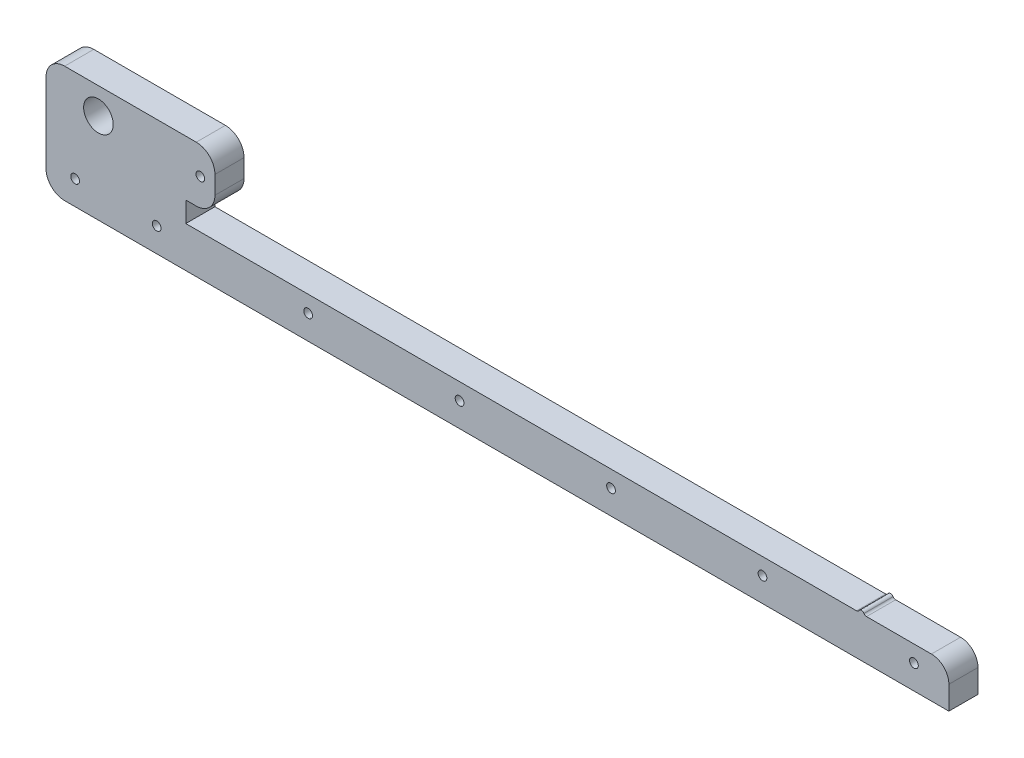
ISO-10303-21;
HEADER;
FILE_DESCRIPTION(('STEP AP214'),'2;1');
FILE_NAME('part.step','',(''),(''),'','','');
FILE_SCHEMA(('AUTOMOTIVE_DESIGN { 1 0 10303 214 1 1 1 1 }'));
ENDSEC;
DATA;
#1=APPLICATION_CONTEXT('core data for automotive mechanical design processes');
#2=APPLICATION_PROTOCOL_DEFINITION('international standard','automotive_design',2000,#1);
#3=PRODUCT_CONTEXT('',#1,'mechanical');
#4=PRODUCT('Part','Part','',(#3));
#5=PRODUCT_RELATED_PRODUCT_CATEGORY('part','',(#4));
#6=PRODUCT_DEFINITION_FORMATION('','',#4);
#7=PRODUCT_DEFINITION_CONTEXT('part definition',#1,'design');
#8=PRODUCT_DEFINITION('design','',#6,#7);
#9=PRODUCT_DEFINITION_SHAPE('','',#8);
#10=(LENGTH_UNIT() NAMED_UNIT(*) SI_UNIT(.MILLI.,.METRE.));
#11=(NAMED_UNIT(*) PLANE_ANGLE_UNIT() SI_UNIT($,.RADIAN.));
#12=(NAMED_UNIT(*) SI_UNIT($,.STERADIAN.) SOLID_ANGLE_UNIT());
#13=UNCERTAINTY_MEASURE_WITH_UNIT(LENGTH_MEASURE(1.E-05),#10,'distance_accuracy_value','');
#14=(GEOMETRIC_REPRESENTATION_CONTEXT(3) GLOBAL_UNCERTAINTY_ASSIGNED_CONTEXT((#13)) GLOBAL_UNIT_ASSIGNED_CONTEXT((#10,
#11,#12)) REPRESENTATION_CONTEXT('',''));
#15=CARTESIAN_POINT('',(0.,0.,0.));
#16=DIRECTION('',(0.,0.,1.));
#17=DIRECTION('',(1.,0.,0.));
#18=AXIS2_PLACEMENT_3D('',#15,#16,#17);
#19=CARTESIAN_POINT('',(394.238844697837,-424.745595982709,10.));
#20=DIRECTION('',(0.,-1.,0.));
#21=DIRECTION('',(0.,0.,-1.));
#22=AXIS2_PLACEMENT_3D('',#19,#20,#21);
#23=PLANE('',#22);
#24=DIRECTION('',(0.,0.,1.));
#25=VECTOR('',#24,1.);
#26=CARTESIAN_POINT('',(627.970895505406,-424.745595982709,0.));
#27=LINE('',#26,#25);
#28=CARTESIAN_POINT('',(627.970895505406,-424.745595982709,0.));
#29=VERTEX_POINT('',#28);
#30=CARTESIAN_POINT('',(627.970895505406,-424.745595982709,10.));
#31=VERTEX_POINT('',#30);
#32=EDGE_CURVE('E58',#29,#31,#27,.T.);
#33=ORIENTED_EDGE('',*,*,#32,.T.);
#34=DIRECTION('',(-1.,0.,0.));
#35=VECTOR('',#34,1.);
#36=CARTESIAN_POINT('',(394.238844697837,-424.745595982709,10.));
#37=LINE('',#36,#35);
#38=CARTESIAN_POINT('',(650.238844697837,-424.745595982709,10.));
#39=VERTEX_POINT('',#38);
#40=EDGE_CURVE('E260',#39,#31,#37,.T.);
#41=ORIENTED_EDGE('',*,*,#40,.F.);
#42=DIRECTION('',(0.,0.,-1.));
#43=VECTOR('',#42,1.);
#44=CARTESIAN_POINT('',(650.238844697837,-424.745595982709,10.));
#45=LINE('',#44,#43);
#46=CARTESIAN_POINT('',(650.238844697837,-424.745595982709,0.));
#47=VERTEX_POINT('',#46);
#48=EDGE_CURVE('E197',#39,#47,#45,.T.);
#49=ORIENTED_EDGE('',*,*,#48,.T.);
#50=DIRECTION('',(-1.,0.,0.));
#51=VECTOR('',#50,1.);
#52=CARTESIAN_POINT('',(394.238844697837,-424.745595982709,0.));
#53=LINE('',#52,#51);
#54=EDGE_CURVE('E286',#47,#29,#53,.T.);
#55=ORIENTED_EDGE('',*,*,#54,.T.);
#56=EDGE_LOOP('',(#33,#41,#49,#55));
#57=FACE_BOUND('',#56,.T.);
#58=ADVANCED_FACE('F35',(#57),#23,.F.);
#59=CARTESIAN_POINT('',(624.506793890268,-424.745595982709,10.));
#60=VERTEX_POINT('',#59);
#61=CARTESIAN_POINT('',(394.238844697837,-424.745595982709,10.));
#62=VERTEX_POINT('',#61);
#63=EDGE_CURVE('E50',#60,#62,#37,.T.);
#64=ORIENTED_EDGE('',*,*,#63,.F.);
#65=DIRECTION('',(0.,0.,1.));
#66=VECTOR('',#65,1.);
#67=CARTESIAN_POINT('',(624.506793890268,-424.745595982709,0.));
#68=LINE('',#67,#66);
#69=CARTESIAN_POINT('',(624.506793890268,-424.745595982709,0.));
#70=VERTEX_POINT('',#69);
#71=EDGE_CURVE('E189',#70,#60,#68,.T.);
#72=ORIENTED_EDGE('',*,*,#71,.F.);
#73=CARTESIAN_POINT('',(394.238844697837,-424.745595982709,0.));
#74=VERTEX_POINT('',#73);
#75=EDGE_CURVE('E285',#70,#74,#53,.T.);
#76=ORIENTED_EDGE('',*,*,#75,.T.);
#77=DIRECTION('',(0.,0.,-1.));
#78=VECTOR('',#77,1.);
#79=CARTESIAN_POINT('',(394.238844697837,-424.745595982709,10.));
#80=LINE('',#79,#78);
#81=EDGE_CURVE('E11',#62,#74,#80,.T.);
#82=ORIENTED_EDGE('',*,*,#81,.F.);
#83=EDGE_LOOP('',(#64,#72,#76,#82));
#84=FACE_BOUND('',#83,.T.);
#85=ADVANCED_FACE('F360',(#84),#23,.F.);
#86=CARTESIAN_POINT('',(656.238844697837,-438.745595982709,10.));
#87=DIRECTION('',(-1.,0.,0.));
#88=DIRECTION('',(0.,0.,1.));
#89=AXIS2_PLACEMENT_3D('',#86,#87,#88);
#90=PLANE('',#89);
#91=DIRECTION('',(0.,1.,0.));
#92=VECTOR('',#91,1.);
#93=CARTESIAN_POINT('',(656.238844697837,-438.745595982709,0.));
#94=LINE('',#93,#92);
#95=CARTESIAN_POINT('',(656.238844697837,-438.745595982709,0.));
#96=VERTEX_POINT('',#95);
#97=CARTESIAN_POINT('',(656.238844697837,-430.745595982709,0.));
#98=VERTEX_POINT('',#97);
#99=EDGE_CURVE('E253',#96,#98,#94,.T.);
#100=ORIENTED_EDGE('',*,*,#99,.T.);
#101=DIRECTION('',(0.,0.,-1.));
#102=VECTOR('',#101,1.);
#103=CARTESIAN_POINT('',(656.238844697837,-430.745595982709,10.));
#104=LINE('',#103,#102);
#105=CARTESIAN_POINT('',(656.238844697837,-430.745595982709,10.));
#106=VERTEX_POINT('',#105);
#107=EDGE_CURVE('E195',#106,#98,#104,.T.);
#108=ORIENTED_EDGE('',*,*,#107,.F.);
#109=DIRECTION('',(0.,1.,0.));
#110=VECTOR('',#109,1.);
#111=CARTESIAN_POINT('',(656.238844697837,-438.745595982709,10.));
#112=LINE('',#111,#110);
#113=CARTESIAN_POINT('',(656.238844697837,-438.745595982709,10.));
#114=VERTEX_POINT('',#113);
#115=EDGE_CURVE('E256',#114,#106,#112,.T.);
#116=ORIENTED_EDGE('',*,*,#115,.F.);
#117=DIRECTION('',(0.,0.,-1.));
#118=VECTOR('',#117,1.);
#119=CARTESIAN_POINT('',(656.238844697837,-438.745595982709,10.));
#120=LINE('',#119,#118);
#121=EDGE_CURVE('E282',#114,#96,#120,.T.);
#122=ORIENTED_EDGE('',*,*,#121,.T.);
#123=EDGE_LOOP('',(#100,#108,#116,#122));
#124=FACE_BOUND('',#123,.T.);
#125=ADVANCED_FACE('F37',(#124),#90,.F.);
#126=CARTESIAN_POINT('',(394.238844697837,-424.745595982709,10.));
#127=DIRECTION('',(-1.,0.,0.));
#128=DIRECTION('',(0.,0.,1.));
#129=AXIS2_PLACEMENT_3D('',#126,#127,#128);
#130=PLANE('',#129);
#131=DIRECTION('',(0.,1.,0.));
#132=VECTOR('',#131,1.);
#133=CARTESIAN_POINT('',(394.238844697837,-424.745595982709,0.));
#134=LINE('',#133,#132);
#135=CARTESIAN_POINT('',(394.238844697837,-417.745595982709,0.));
#136=VERTEX_POINT('',#135);
#137=EDGE_CURVE('E288',#74,#136,#134,.T.);
#138=ORIENTED_EDGE('',*,*,#137,.T.);
#139=DIRECTION('',(0.,0.,-1.));
#140=VECTOR('',#139,1.);
#141=CARTESIAN_POINT('',(394.238844697837,-417.745595982709,10.));
#142=LINE('',#141,#140);
#143=CARTESIAN_POINT('',(394.238844697837,-417.745595982709,10.));
#144=VERTEX_POINT('',#143);
#145=EDGE_CURVE('E43',#144,#136,#142,.T.);
#146=ORIENTED_EDGE('',*,*,#145,.F.);
#147=DIRECTION('',(0.,1.,0.));
#148=VECTOR('',#147,1.);
#149=CARTESIAN_POINT('',(394.238844697837,-424.745595982709,10.));
#150=LINE('',#149,#148);
#151=EDGE_CURVE('E262',#62,#144,#150,.T.);
#152=ORIENTED_EDGE('',*,*,#151,.F.);
#153=ORIENTED_EDGE('',*,*,#81,.T.);
#154=EDGE_LOOP('',(#138,#146,#152,#153));
#155=FACE_BOUND('',#154,.T.);
#156=ADVANCED_FACE('F359',(#155),#130,.F.);
#157=CARTESIAN_POINT('',(397.838844697837,-417.745595982709,10.));
#158=DIRECTION('',(0.,1.,0.));
#159=DIRECTION('',(0.,0.,1.));
#160=AXIS2_PLACEMENT_3D('',#157,#158,#159);
#161=PLANE('',#160);
#162=DIRECTION('',(1.,0.,0.));
#163=VECTOR('',#162,1.);
#164=CARTESIAN_POINT('',(397.838844697837,-417.745595982709,0.));
#165=LINE('',#164,#163);
#166=CARTESIAN_POINT('',(397.838844697837,-417.745595982709,0.));
#167=VERTEX_POINT('',#166);
#168=EDGE_CURVE('E290',#136,#167,#165,.T.);
#169=ORIENTED_EDGE('',*,*,#168,.T.);
#170=DIRECTION('',(0.,0.,-1.));
#171=VECTOR('',#170,1.);
#172=CARTESIAN_POINT('',(397.838844697837,-417.745595982709,10.));
#173=LINE('',#172,#171);
#174=CARTESIAN_POINT('',(397.838844697837,-417.745595982709,10.));
#175=VERTEX_POINT('',#174);
#176=EDGE_CURVE('E331',#175,#167,#173,.T.);
#177=ORIENTED_EDGE('',*,*,#176,.F.);
#178=DIRECTION('',(1.,0.,0.));
#179=VECTOR('',#178,1.);
#180=CARTESIAN_POINT('',(397.838844697837,-417.745595982709,10.));
#181=LINE('',#180,#179);
#182=EDGE_CURVE('E264',#144,#175,#181,.T.);
#183=ORIENTED_EDGE('',*,*,#182,.F.);
#184=ORIENTED_EDGE('',*,*,#145,.T.);
#185=EDGE_LOOP('',(#169,#177,#183,#184));
#186=FACE_BOUND('',#185,.T.);
#187=ADVANCED_FACE('F338',(#186),#161,.F.);
#188=CARTESIAN_POINT('',(397.838844697837,-411.345595982709,10.));
#189=DIRECTION('',(0.,0.,-1.));
#190=DIRECTION('',(-1.,0.,0.));
#191=AXIS2_PLACEMENT_3D('',#188,#189,#190);
#192=CYLINDRICAL_SURFACE('',#191,6.40000000000002);
#193=CARTESIAN_POINT('',(397.838844697837,-411.345595982709,0.));
#194=DIRECTION('',(0.,0.,1.));
#195=DIRECTION('',(1.,0.,0.));
#196=AXIS2_PLACEMENT_3D('',#193,#194,#195);
#197=CIRCLE('',#196,6.40000000000002);
#198=CARTESIAN_POINT('',(404.238844697837,-411.345595982709,0.));
#199=VERTEX_POINT('',#198);
#200=EDGE_CURVE('E292',#167,#199,#197,.T.);
#201=ORIENTED_EDGE('',*,*,#200,.T.);
#202=DIRECTION('',(0.,0.,-1.));
#203=VECTOR('',#202,1.);
#204=CARTESIAN_POINT('',(404.238844697837,-411.345595982709,10.));
#205=LINE('',#204,#203);
#206=CARTESIAN_POINT('',(404.238844697837,-411.345595982709,10.));
#207=VERTEX_POINT('',#206);
#208=EDGE_CURVE('E328',#207,#199,#205,.T.);
#209=ORIENTED_EDGE('',*,*,#208,.F.);
#210=CARTESIAN_POINT('',(397.838844697837,-411.345595982709,10.));
#211=DIRECTION('',(0.,0.,1.));
#212=DIRECTION('',(1.,0.,0.));
#213=AXIS2_PLACEMENT_3D('',#210,#211,#212);
#214=CIRCLE('',#213,6.40000000000002);
#215=EDGE_CURVE('E266',#175,#207,#214,.T.);
#216=ORIENTED_EDGE('',*,*,#215,.F.);
#217=ORIENTED_EDGE('',*,*,#176,.T.);
#218=EDGE_LOOP('',(#201,#209,#216,#217));
#219=FACE_BOUND('',#218,.T.);
#220=ADVANCED_FACE('F348',(#219),#192,.T.);
#221=CARTESIAN_POINT('',(404.238844697837,-411.345595982709,10.));
#222=DIRECTION('',(-1.,0.,0.));
#223=DIRECTION('',(0.,0.,1.));
#224=AXIS2_PLACEMENT_3D('',#221,#222,#223);
#225=PLANE('',#224);
#226=DIRECTION('',(0.,1.,0.));
#227=VECTOR('',#226,1.);
#228=CARTESIAN_POINT('',(404.238844697837,-411.345595982709,0.));
#229=LINE('',#228,#227);
#230=CARTESIAN_POINT('',(404.238844697837,-405.145595982709,0.));
#231=VERTEX_POINT('',#230);
#232=EDGE_CURVE('E294',#199,#231,#229,.T.);
#233=ORIENTED_EDGE('',*,*,#232,.T.);
#234=DIRECTION('',(0.,0.,-1.));
#235=VECTOR('',#234,1.);
#236=CARTESIAN_POINT('',(404.238844697837,-405.145595982709,10.));
#237=LINE('',#236,#235);
#238=CARTESIAN_POINT('',(404.238844697837,-405.145595982709,10.));
#239=VERTEX_POINT('',#238);
#240=EDGE_CURVE('E325',#239,#231,#237,.T.);
#241=ORIENTED_EDGE('',*,*,#240,.F.);
#242=DIRECTION('',(0.,1.,0.));
#243=VECTOR('',#242,1.);
#244=CARTESIAN_POINT('',(404.238844697837,-411.345595982709,10.));
#245=LINE('',#244,#243);
#246=EDGE_CURVE('E268',#207,#239,#245,.T.);
#247=ORIENTED_EDGE('',*,*,#246,.F.);
#248=ORIENTED_EDGE('',*,*,#208,.T.);
#249=EDGE_LOOP('',(#233,#241,#247,#248));
#250=FACE_BOUND('',#249,.T.);
#251=ADVANCED_FACE('F352',(#250),#225,.F.);
#252=CARTESIAN_POINT('',(397.838844697837,-405.145595982709,10.));
#253=DIRECTION('',(0.,0.,-1.));
#254=DIRECTION('',(-1.,0.,0.));
#255=AXIS2_PLACEMENT_3D('',#252,#253,#254);
#256=CYLINDRICAL_SURFACE('',#255,6.40000000000002);
#257=CARTESIAN_POINT('',(397.838844697837,-405.145595982709,0.));
#258=DIRECTION('',(0.,0.,1.));
#259=DIRECTION('',(-1.,0.,0.));
#260=AXIS2_PLACEMENT_3D('',#257,#258,#259);
#261=CIRCLE('',#260,6.40000000000002);
#262=CARTESIAN_POINT('',(397.838844697837,-398.745595982709,0.));
#263=VERTEX_POINT('',#262);
#264=EDGE_CURVE('E296',#231,#263,#261,.T.);
#265=ORIENTED_EDGE('',*,*,#264,.T.);
#266=DIRECTION('',(0.,0.,-1.));
#267=VECTOR('',#266,1.);
#268=CARTESIAN_POINT('',(397.838844697837,-398.745595982709,10.));
#269=LINE('',#268,#267);
#270=CARTESIAN_POINT('',(397.838844697837,-398.745595982709,10.));
#271=VERTEX_POINT('',#270);
#272=EDGE_CURVE('E322',#271,#263,#269,.T.);
#273=ORIENTED_EDGE('',*,*,#272,.F.);
#274=CARTESIAN_POINT('',(397.838844697837,-405.145595982709,10.));
#275=DIRECTION('',(0.,0.,1.));
#276=DIRECTION('',(-1.,0.,0.));
#277=AXIS2_PLACEMENT_3D('',#274,#275,#276);
#278=CIRCLE('',#277,6.40000000000002);
#279=EDGE_CURVE('E270',#239,#271,#278,.T.);
#280=ORIENTED_EDGE('',*,*,#279,.F.);
#281=ORIENTED_EDGE('',*,*,#240,.T.);
#282=EDGE_LOOP('',(#265,#273,#280,#281));
#283=FACE_BOUND('',#282,.T.);
#284=ADVANCED_FACE('F393',(#283),#256,.T.);
#285=CARTESIAN_POINT('',(352.638844697837,-398.745595982709,10.));
#286=DIRECTION('',(0.,-1.,0.));
#287=DIRECTION('',(0.,0.,-1.));
#288=AXIS2_PLACEMENT_3D('',#285,#286,#287);
#289=PLANE('',#288);
#290=DIRECTION('',(-1.,0.,0.));
#291=VECTOR('',#290,1.);
#292=CARTESIAN_POINT('',(352.638844697837,-398.745595982709,0.));
#293=LINE('',#292,#291);
#294=CARTESIAN_POINT('',(352.638844697837,-398.745595982709,0.));
#295=VERTEX_POINT('',#294);
#296=EDGE_CURVE('E299',#263,#295,#293,.T.);
#297=ORIENTED_EDGE('',*,*,#296,.T.);
#298=DIRECTION('',(0.,0.,-1.));
#299=VECTOR('',#298,1.);
#300=CARTESIAN_POINT('',(352.638844697837,-398.745595982709,10.));
#301=LINE('',#300,#299);
#302=CARTESIAN_POINT('',(352.638844697837,-398.745595982709,10.));
#303=VERTEX_POINT('',#302);
#304=EDGE_CURVE('E319',#303,#295,#301,.T.);
#305=ORIENTED_EDGE('',*,*,#304,.F.);
#306=DIRECTION('',(-1.,0.,0.));
#307=VECTOR('',#306,1.);
#308=CARTESIAN_POINT('',(394.238844697837,-398.745595982709,10.));
#309=LINE('',#308,#307);
#310=EDGE_CURVE('E272',#271,#303,#309,.T.);
#311=ORIENTED_EDGE('',*,*,#310,.F.);
#312=ORIENTED_EDGE('',*,*,#272,.T.);
#313=EDGE_LOOP('',(#297,#305,#311,#312));
#314=FACE_BOUND('',#313,.T.);
#315=ADVANCED_FACE('F395',(#314),#289,.F.);
#316=CARTESIAN_POINT('',(352.638844697837,-405.145595982709,10.));
#317=DIRECTION('',(0.,0.,-1.));
#318=DIRECTION('',(-1.,0.,0.));
#319=AXIS2_PLACEMENT_3D('',#316,#317,#318);
#320=CYLINDRICAL_SURFACE('',#319,6.40000000000002);
#321=CARTESIAN_POINT('',(352.638844697837,-405.145595982709,0.));
#322=DIRECTION('',(0.,0.,1.));
#323=DIRECTION('',(-1.,0.,0.));
#324=AXIS2_PLACEMENT_3D('',#321,#322,#323);
#325=CIRCLE('',#324,6.40000000000002);
#326=CARTESIAN_POINT('',(346.238844697837,-405.145595982709,0.));
#327=VERTEX_POINT('',#326);
#328=EDGE_CURVE('E301',#295,#327,#325,.T.);
#329=ORIENTED_EDGE('',*,*,#328,.T.);
#330=DIRECTION('',(0.,0.,-1.));
#331=VECTOR('',#330,1.);
#332=CARTESIAN_POINT('',(346.238844697837,-405.145595982709,10.));
#333=LINE('',#332,#331);
#334=CARTESIAN_POINT('',(346.238844697837,-405.145595982709,10.));
#335=VERTEX_POINT('',#334);
#336=EDGE_CURVE('E316',#335,#327,#333,.T.);
#337=ORIENTED_EDGE('',*,*,#336,.F.);
#338=CARTESIAN_POINT('',(352.638844697837,-405.145595982709,10.));
#339=DIRECTION('',(0.,0.,1.));
#340=DIRECTION('',(-1.,0.,0.));
#341=AXIS2_PLACEMENT_3D('',#338,#339,#340);
#342=CIRCLE('',#341,6.40000000000002);
#343=EDGE_CURVE('E274',#303,#335,#342,.T.);
#344=ORIENTED_EDGE('',*,*,#343,.F.);
#345=ORIENTED_EDGE('',*,*,#304,.T.);
#346=EDGE_LOOP('',(#329,#337,#344,#345));
#347=FACE_BOUND('',#346,.T.);
#348=ADVANCED_FACE('F389',(#347),#320,.T.);
#349=CARTESIAN_POINT('',(346.238844697837,-432.345595982709,10.));
#350=DIRECTION('',(1.,0.,0.));
#351=DIRECTION('',(0.,0.,-1.));
#352=AXIS2_PLACEMENT_3D('',#349,#350,#351);
#353=PLANE('',#352);
#354=DIRECTION('',(0.,-1.,0.));
#355=VECTOR('',#354,1.);
#356=CARTESIAN_POINT('',(346.238844697837,-432.345595982709,0.));
#357=LINE('',#356,#355);
#358=CARTESIAN_POINT('',(346.238844697837,-432.345595982709,0.));
#359=VERTEX_POINT('',#358);
#360=EDGE_CURVE('E303',#327,#359,#357,.T.);
#361=ORIENTED_EDGE('',*,*,#360,.T.);
#362=DIRECTION('',(0.,0.,-1.));
#363=VECTOR('',#362,1.);
#364=CARTESIAN_POINT('',(346.238844697837,-432.345595982709,10.));
#365=LINE('',#364,#363);
#366=CARTESIAN_POINT('',(346.238844697837,-432.345595982709,10.));
#367=VERTEX_POINT('',#366);
#368=EDGE_CURVE('E313',#367,#359,#365,.T.);
#369=ORIENTED_EDGE('',*,*,#368,.F.);
#370=DIRECTION('',(0.,-1.,0.));
#371=VECTOR('',#370,1.);
#372=CARTESIAN_POINT('',(346.238844697837,-432.345595982709,10.));
#373=LINE('',#372,#371);
#374=EDGE_CURVE('E276',#335,#367,#373,.T.);
#375=ORIENTED_EDGE('',*,*,#374,.F.);
#376=ORIENTED_EDGE('',*,*,#336,.T.);
#377=EDGE_LOOP('',(#361,#369,#375,#376));
#378=FACE_BOUND('',#377,.T.);
#379=ADVANCED_FACE('F385',(#378),#353,.F.);
#380=CARTESIAN_POINT('',(352.638844697837,-432.345595982709,10.));
#381=DIRECTION('',(0.,0.,-1.));
#382=DIRECTION('',(-1.,0.,0.));
#383=AXIS2_PLACEMENT_3D('',#380,#381,#382);
#384=CYLINDRICAL_SURFACE('',#383,6.40000000000002);
#385=CARTESIAN_POINT('',(352.638844697837,-432.345595982709,0.));
#386=DIRECTION('',(0.,0.,1.));
#387=DIRECTION('',(-1.,0.,0.));
#388=AXIS2_PLACEMENT_3D('',#385,#386,#387);
#389=CIRCLE('',#388,6.40000000000002);
#390=CARTESIAN_POINT('',(352.638844697837,-438.745595982709,0.));
#391=VERTEX_POINT('',#390);
#392=EDGE_CURVE('E305',#359,#391,#389,.T.);
#393=ORIENTED_EDGE('',*,*,#392,.T.);
#394=DIRECTION('',(0.,0.,-1.));
#395=VECTOR('',#394,1.);
#396=CARTESIAN_POINT('',(352.638844697837,-438.745595982709,10.));
#397=LINE('',#396,#395);
#398=CARTESIAN_POINT('',(352.638844697837,-438.745595982709,10.));
#399=VERTEX_POINT('',#398);
#400=EDGE_CURVE('E310',#399,#391,#397,.T.);
#401=ORIENTED_EDGE('',*,*,#400,.F.);
#402=CARTESIAN_POINT('',(352.638844697837,-432.345595982709,10.));
#403=DIRECTION('',(0.,0.,1.));
#404=DIRECTION('',(-1.,0.,0.));
#405=AXIS2_PLACEMENT_3D('',#402,#403,#404);
#406=CIRCLE('',#405,6.40000000000002);
#407=EDGE_CURVE('E278',#367,#399,#406,.T.);
#408=ORIENTED_EDGE('',*,*,#407,.F.);
#409=ORIENTED_EDGE('',*,*,#368,.T.);
#410=EDGE_LOOP('',(#393,#401,#408,#409));
#411=FACE_BOUND('',#410,.T.);
#412=ADVANCED_FACE('F380',(#411),#384,.T.);
#413=CARTESIAN_POINT('',(656.238844697837,-438.745595982709,10.));
#414=DIRECTION('',(0.,1.,0.));
#415=DIRECTION('',(0.,0.,1.));
#416=AXIS2_PLACEMENT_3D('',#413,#414,#415);
#417=PLANE('',#416);
#418=DIRECTION('',(1.,0.,0.));
#419=VECTOR('',#418,1.);
#420=CARTESIAN_POINT('',(656.238844697837,-438.745595982709,0.));
#421=LINE('',#420,#419);
#422=EDGE_CURVE('E259',#391,#96,#421,.T.);
#423=ORIENTED_EDGE('',*,*,#422,.T.);
#424=ORIENTED_EDGE('',*,*,#121,.F.);
#425=DIRECTION('',(1.,0.,0.));
#426=VECTOR('',#425,1.);
#427=CARTESIAN_POINT('',(656.238844697837,-438.745595982709,10.));
#428=LINE('',#427,#426);
#429=EDGE_CURVE('E280',#399,#114,#428,.T.);
#430=ORIENTED_EDGE('',*,*,#429,.F.);
#431=ORIENTED_EDGE('',*,*,#400,.T.);
#432=EDGE_LOOP('',(#423,#424,#430,#431));
#433=FACE_BOUND('',#432,.T.);
#434=ADVANCED_FACE('F374',(#433),#417,.F.);
#435=CARTESIAN_POINT('',(397.838844697837,-411.345595982709,10.));
#436=DIRECTION('',(0.,0.,1.));
#437=DIRECTION('',(1.,0.,0.));
#438=AXIS2_PLACEMENT_3D('',#435,#436,#437);
#439=PLANE('',#438);
#440=CARTESIAN_POINT('',(650.238844697837,-430.745595982709,10.));
#441=DIRECTION('',(0.,0.,1.));
#442=DIRECTION('',(-1.,0.,0.));
#443=AXIS2_PLACEMENT_3D('',#440,#441,#442);
#444=CIRCLE('',#443,6.00000000000001);
#445=EDGE_CURVE('E192',#106,#39,#444,.T.);
#446=ORIENTED_EDGE('',*,*,#445,.T.);
#447=ORIENTED_EDGE('',*,*,#40,.T.);
#448=CARTESIAN_POINT('',(627.970895505406,-423.745595982709,10.));
#449=DIRECTION('',(0.,0.,-1.));
#450=DIRECTION('',(1.,0.,0.));
#451=AXIS2_PLACEMENT_3D('',#448,#449,#450);
#452=CIRCLE('',#451,1.);
#453=CARTESIAN_POINT('',(627.104870101621,-424.245595982709,10.));
#454=VERTEX_POINT('',#453);
#455=EDGE_CURVE('E184',#31,#454,#452,.T.);
#456=ORIENTED_EDGE('',*,*,#455,.T.);
#457=CARTESIAN_POINT('',(626.238844697837,-424.745595982709,10.));
#458=DIRECTION('',(0.,0.,1.));
#459=DIRECTION('',(1.,0.,0.));
#460=AXIS2_PLACEMENT_3D('',#457,#458,#459);
#461=CIRCLE('',#460,1.);
#462=CARTESIAN_POINT('',(625.372819294052,-424.245595982709,10.));
#463=VERTEX_POINT('',#462);
#464=EDGE_CURVE('E161',#454,#463,#461,.T.);
#465=ORIENTED_EDGE('',*,*,#464,.T.);
#466=CARTESIAN_POINT('',(624.506793890268,-423.745595982709,10.));
#467=DIRECTION('',(0.,0.,-1.));
#468=DIRECTION('',(-1.,0.,0.));
#469=AXIS2_PLACEMENT_3D('',#466,#467,#468);
#470=CIRCLE('',#469,1.);
#471=EDGE_CURVE('E178',#463,#60,#470,.T.);
#472=ORIENTED_EDGE('',*,*,#471,.T.);
#473=ORIENTED_EDGE('',*,*,#63,.T.);
#474=ORIENTED_EDGE('',*,*,#151,.T.);
#475=ORIENTED_EDGE('',*,*,#182,.T.);
#476=ORIENTED_EDGE('',*,*,#215,.T.);
#477=ORIENTED_EDGE('',*,*,#246,.T.);
#478=ORIENTED_EDGE('',*,*,#279,.T.);
#479=ORIENTED_EDGE('',*,*,#310,.T.);
#480=ORIENTED_EDGE('',*,*,#343,.T.);
#481=ORIENTED_EDGE('',*,*,#374,.T.);
#482=ORIENTED_EDGE('',*,*,#407,.T.);
#483=ORIENTED_EDGE('',*,*,#429,.T.);
#484=ORIENTED_EDGE('',*,*,#115,.T.);
#485=EDGE_LOOP('',(#446,#447,#456,#465,#472,#473,#474,#475,#476,#477,#478,#479,#480,#481,#482,
#483,#484));
#486=FACE_BOUND('',#485,.T.);
#487=CARTESIAN_POINT('',(364.238844697837,-407.745595982709,10.));
#488=DIRECTION('',(0.,0.,-1.));
#489=DIRECTION('',(-1.,0.,0.));
#490=AXIS2_PLACEMENT_3D('',#487,#488,#489);
#491=CIRCLE('',#490,5.07499999999998);
#492=CARTESIAN_POINT('',(359.163844697837,-407.745595982709,10.));
#493=VERTEX_POINT('',#492);
#494=EDGE_CURVE('E202',#493,#493,#491,.T.);
#495=ORIENTED_EDGE('',*,*,#494,.T.);
#496=EDGE_LOOP('',(#495));
#497=FACE_BOUND('',#496,.T.);
#498=CARTESIAN_POINT('',(399.238844697837,-408.245595982709,10.));
#499=DIRECTION('',(0.,0.,1.));
#500=DIRECTION('',(1.,0.,0.));
#501=AXIS2_PLACEMENT_3D('',#498,#499,#500);
#502=CIRCLE('',#501,1.50000000000002);
#503=CARTESIAN_POINT('',(400.738844697837,-408.245595982709,10.));
#504=VERTEX_POINT('',#503);
#505=EDGE_CURVE('E205',#504,#504,#502,.T.);
#506=ORIENTED_EDGE('',*,*,#505,.F.);
#507=EDGE_LOOP('',(#506));
#508=FACE_BOUND('',#507,.T.);
#509=CARTESIAN_POINT('',(356.238844697836,-430.436890599708,10.));
#510=DIRECTION('',(0.,0.,1.));
#511=DIRECTION('',(1.,0.,0.));
#512=AXIS2_PLACEMENT_3D('',#509,#510,#511);
#513=CIRCLE('',#512,1.50000000000002);
#514=CARTESIAN_POINT('',(357.738844697836,-430.436890599708,10.));
#515=VERTEX_POINT('',#514);
#516=EDGE_CURVE('E211',#515,#515,#513,.T.);
#517=ORIENTED_EDGE('',*,*,#516,.F.);
#518=EDGE_LOOP('',(#517));
#519=FACE_BOUND('',#518,.T.);
#520=CARTESIAN_POINT('',(384.238844697836,-430.436890599708,10.));
#521=DIRECTION('',(0.,0.,1.));
#522=DIRECTION('',(1.,0.,0.));
#523=AXIS2_PLACEMENT_3D('',#520,#521,#522);
#524=CIRCLE('',#523,1.50000000000002);
#525=CARTESIAN_POINT('',(385.738844697836,-430.436890599708,10.));
#526=VERTEX_POINT('',#525);
#527=EDGE_CURVE('E217',#526,#526,#524,.T.);
#528=ORIENTED_EDGE('',*,*,#527,.F.);
#529=EDGE_LOOP('',(#528));
#530=FACE_BOUND('',#529,.T.);
#531=CARTESIAN_POINT('',(436.238844697836,-430.436890599708,10.));
#532=DIRECTION('',(0.,0.,1.));
#533=DIRECTION('',(1.,0.,0.));
#534=AXIS2_PLACEMENT_3D('',#531,#532,#533);
#535=CIRCLE('',#534,1.50000000000002);
#536=CARTESIAN_POINT('',(437.738844697836,-430.436890599708,10.));
#537=VERTEX_POINT('',#536);
#538=EDGE_CURVE('E223',#537,#537,#535,.T.);
#539=ORIENTED_EDGE('',*,*,#538,.F.);
#540=EDGE_LOOP('',(#539));
#541=FACE_BOUND('',#540,.T.);
#542=CARTESIAN_POINT('',(488.238844697836,-430.436890599709,10.));
#543=DIRECTION('',(0.,0.,1.));
#544=DIRECTION('',(1.,0.,0.));
#545=AXIS2_PLACEMENT_3D('',#542,#543,#544);
#546=CIRCLE('',#545,1.50000000000002);
#547=CARTESIAN_POINT('',(489.738844697836,-430.436890599709,10.));
#548=VERTEX_POINT('',#547);
#549=EDGE_CURVE('E229',#548,#548,#546,.T.);
#550=ORIENTED_EDGE('',*,*,#549,.F.);
#551=EDGE_LOOP('',(#550));
#552=FACE_BOUND('',#551,.T.);
#553=CARTESIAN_POINT('',(540.238844697836,-430.436890599709,10.));
#554=DIRECTION('',(0.,0.,1.));
#555=DIRECTION('',(1.,0.,0.));
#556=AXIS2_PLACEMENT_3D('',#553,#554,#555);
#557=CIRCLE('',#556,1.50000000000008);
#558=CARTESIAN_POINT('',(541.738844697836,-430.436890599709,10.));
#559=VERTEX_POINT('',#558);
#560=EDGE_CURVE('E235',#559,#559,#557,.T.);
#561=ORIENTED_EDGE('',*,*,#560,.F.);
#562=EDGE_LOOP('',(#561));
#563=FACE_BOUND('',#562,.T.);
#564=CARTESIAN_POINT('',(592.238844697836,-430.436890599709,10.));
#565=DIRECTION('',(0.,0.,1.));
#566=DIRECTION('',(1.,0.,0.));
#567=AXIS2_PLACEMENT_3D('',#564,#565,#566);
#568=CIRCLE('',#567,1.49999999999997);
#569=CARTESIAN_POINT('',(593.738844697836,-430.436890599709,10.));
#570=VERTEX_POINT('',#569);
#571=EDGE_CURVE('E241',#570,#570,#568,.T.);
#572=ORIENTED_EDGE('',*,*,#571,.F.);
#573=EDGE_LOOP('',(#572));
#574=FACE_BOUND('',#573,.T.);
#575=CARTESIAN_POINT('',(644.238844697836,-430.43689059971,10.));
#576=DIRECTION('',(0.,0.,1.));
#577=DIRECTION('',(1.,0.,0.));
#578=AXIS2_PLACEMENT_3D('',#575,#576,#577);
#579=CIRCLE('',#578,1.49999999999997);
#580=CARTESIAN_POINT('',(645.738844697836,-430.43689059971,10.));
#581=VERTEX_POINT('',#580);
#582=EDGE_CURVE('E247',#581,#581,#579,.T.);
#583=ORIENTED_EDGE('',*,*,#582,.F.);
#584=EDGE_LOOP('',(#583));
#585=FACE_BOUND('',#584,.T.);
#586=ADVANCED_FACE('F356',(#486,#497,#508,#519,#530,#541,#552,#563,#574,#585),#439,.T.);
#587=CARTESIAN_POINT('',(397.838844697837,-411.345595982709,0.));
#588=DIRECTION('',(0.,0.,1.));
#589=DIRECTION('',(1.,0.,0.));
#590=AXIS2_PLACEMENT_3D('',#587,#588,#589);
#591=PLANE('',#590);
#592=CARTESIAN_POINT('',(364.238844697837,-407.745595982709,0.));
#593=DIRECTION('',(0.,0.,-1.));
#594=DIRECTION('',(-1.,0.,0.));
#595=AXIS2_PLACEMENT_3D('',#592,#593,#594);
#596=CIRCLE('',#595,5.07499999999998);
#597=CARTESIAN_POINT('',(359.163844697837,-407.745595982709,0.));
#598=VERTEX_POINT('',#597);
#599=EDGE_CURVE('E200',#598,#598,#596,.T.);
#600=ORIENTED_EDGE('',*,*,#599,.F.);
#601=EDGE_LOOP('',(#600));
#602=FACE_BOUND('',#601,.T.);
#603=CARTESIAN_POINT('',(399.238844697837,-408.245595982709,0.));
#604=DIRECTION('',(0.,0.,1.));
#605=DIRECTION('',(1.,0.,0.));
#606=AXIS2_PLACEMENT_3D('',#603,#604,#605);
#607=CIRCLE('',#606,1.50000000000002);
#608=CARTESIAN_POINT('',(400.738844697837,-408.245595982709,0.));
#609=VERTEX_POINT('',#608);
#610=EDGE_CURVE('E208',#609,#609,#607,.T.);
#611=ORIENTED_EDGE('',*,*,#610,.T.);
#612=EDGE_LOOP('',(#611));
#613=FACE_BOUND('',#612,.T.);
#614=CARTESIAN_POINT('',(356.238844697836,-430.436890599708,0.));
#615=DIRECTION('',(0.,0.,1.));
#616=DIRECTION('',(1.,0.,0.));
#617=AXIS2_PLACEMENT_3D('',#614,#615,#616);
#618=CIRCLE('',#617,1.50000000000002);
#619=CARTESIAN_POINT('',(357.738844697836,-430.436890599708,0.));
#620=VERTEX_POINT('',#619);
#621=EDGE_CURVE('E214',#620,#620,#618,.T.);
#622=ORIENTED_EDGE('',*,*,#621,.T.);
#623=EDGE_LOOP('',(#622));
#624=FACE_BOUND('',#623,.T.);
#625=CARTESIAN_POINT('',(384.238844697836,-430.436890599708,0.));
#626=DIRECTION('',(0.,0.,1.));
#627=DIRECTION('',(1.,0.,0.));
#628=AXIS2_PLACEMENT_3D('',#625,#626,#627);
#629=CIRCLE('',#628,1.50000000000002);
#630=CARTESIAN_POINT('',(385.738844697836,-430.436890599708,0.));
#631=VERTEX_POINT('',#630);
#632=EDGE_CURVE('E220',#631,#631,#629,.T.);
#633=ORIENTED_EDGE('',*,*,#632,.T.);
#634=EDGE_LOOP('',(#633));
#635=FACE_BOUND('',#634,.T.);
#636=CARTESIAN_POINT('',(436.238844697836,-430.436890599708,0.));
#637=DIRECTION('',(0.,0.,1.));
#638=DIRECTION('',(1.,0.,0.));
#639=AXIS2_PLACEMENT_3D('',#636,#637,#638);
#640=CIRCLE('',#639,1.50000000000002);
#641=CARTESIAN_POINT('',(437.738844697836,-430.436890599708,0.));
#642=VERTEX_POINT('',#641);
#643=EDGE_CURVE('E226',#642,#642,#640,.T.);
#644=ORIENTED_EDGE('',*,*,#643,.T.);
#645=EDGE_LOOP('',(#644));
#646=FACE_BOUND('',#645,.T.);
#647=CARTESIAN_POINT('',(488.238844697836,-430.436890599709,0.));
#648=DIRECTION('',(0.,0.,1.));
#649=DIRECTION('',(1.,0.,0.));
#650=AXIS2_PLACEMENT_3D('',#647,#648,#649);
#651=CIRCLE('',#650,1.50000000000002);
#652=CARTESIAN_POINT('',(489.738844697836,-430.436890599709,0.));
#653=VERTEX_POINT('',#652);
#654=EDGE_CURVE('E232',#653,#653,#651,.T.);
#655=ORIENTED_EDGE('',*,*,#654,.T.);
#656=EDGE_LOOP('',(#655));
#657=FACE_BOUND('',#656,.T.);
#658=CARTESIAN_POINT('',(540.238844697836,-430.436890599709,0.));
#659=DIRECTION('',(0.,0.,1.));
#660=DIRECTION('',(1.,0.,0.));
#661=AXIS2_PLACEMENT_3D('',#658,#659,#660);
#662=CIRCLE('',#661,1.50000000000008);
#663=CARTESIAN_POINT('',(541.738844697836,-430.436890599709,0.));
#664=VERTEX_POINT('',#663);
#665=EDGE_CURVE('E238',#664,#664,#662,.T.);
#666=ORIENTED_EDGE('',*,*,#665,.T.);
#667=EDGE_LOOP('',(#666));
#668=FACE_BOUND('',#667,.T.);
#669=CARTESIAN_POINT('',(592.238844697836,-430.436890599709,0.));
#670=DIRECTION('',(0.,0.,1.));
#671=DIRECTION('',(1.,0.,0.));
#672=AXIS2_PLACEMENT_3D('',#669,#670,#671);
#673=CIRCLE('',#672,1.49999999999997);
#674=CARTESIAN_POINT('',(593.738844697836,-430.436890599709,0.));
#675=VERTEX_POINT('',#674);
#676=EDGE_CURVE('E244',#675,#675,#673,.T.);
#677=ORIENTED_EDGE('',*,*,#676,.T.);
#678=EDGE_LOOP('',(#677));
#679=FACE_BOUND('',#678,.T.);
#680=CARTESIAN_POINT('',(644.238844697836,-430.43689059971,0.));
#681=DIRECTION('',(0.,0.,1.));
#682=DIRECTION('',(1.,0.,0.));
#683=AXIS2_PLACEMENT_3D('',#680,#681,#682);
#684=CIRCLE('',#683,1.49999999999997);
#685=CARTESIAN_POINT('',(645.738844697836,-430.43689059971,0.));
#686=VERTEX_POINT('',#685);
#687=EDGE_CURVE('E250',#686,#686,#684,.T.);
#688=ORIENTED_EDGE('',*,*,#687,.T.);
#689=EDGE_LOOP('',(#688));
#690=FACE_BOUND('',#689,.T.);
#691=ORIENTED_EDGE('',*,*,#54,.F.);
#692=CARTESIAN_POINT('',(650.238844697837,-430.745595982709,0.));
#693=DIRECTION('',(0.,0.,1.));
#694=DIRECTION('',(-1.,0.,0.));
#695=AXIS2_PLACEMENT_3D('',#692,#693,#694);
#696=CIRCLE('',#695,6.00000000000001);
#697=EDGE_CURVE('E188',#98,#47,#696,.T.);
#698=ORIENTED_EDGE('',*,*,#697,.F.);
#699=ORIENTED_EDGE('',*,*,#99,.F.);
#700=ORIENTED_EDGE('',*,*,#422,.F.);
#701=ORIENTED_EDGE('',*,*,#392,.F.);
#702=ORIENTED_EDGE('',*,*,#360,.F.);
#703=ORIENTED_EDGE('',*,*,#328,.F.);
#704=ORIENTED_EDGE('',*,*,#296,.F.);
#705=ORIENTED_EDGE('',*,*,#264,.F.);
#706=ORIENTED_EDGE('',*,*,#232,.F.);
#707=ORIENTED_EDGE('',*,*,#200,.F.);
#708=ORIENTED_EDGE('',*,*,#168,.F.);
#709=ORIENTED_EDGE('',*,*,#137,.F.);
#710=ORIENTED_EDGE('',*,*,#75,.F.);
#711=CARTESIAN_POINT('',(624.506793890268,-423.745595982709,0.));
#712=DIRECTION('',(0.,0.,-1.));
#713=DIRECTION('',(-1.,0.,0.));
#714=AXIS2_PLACEMENT_3D('',#711,#712,#713);
#715=CIRCLE('',#714,1.);
#716=CARTESIAN_POINT('',(625.372819294052,-424.245595982709,0.));
#717=VERTEX_POINT('',#716);
#718=EDGE_CURVE('E167',#717,#70,#715,.T.);
#719=ORIENTED_EDGE('',*,*,#718,.F.);
#720=CARTESIAN_POINT('',(626.238844697837,-424.745595982709,0.));
#721=DIRECTION('',(0.,0.,1.));
#722=DIRECTION('',(1.,0.,0.));
#723=AXIS2_PLACEMENT_3D('',#720,#721,#722);
#724=CIRCLE('',#723,1.);
#725=CARTESIAN_POINT('',(627.104870101621,-424.245595982709,0.));
#726=VERTEX_POINT('',#725);
#727=EDGE_CURVE('E159',#726,#717,#724,.T.);
#728=ORIENTED_EDGE('',*,*,#727,.F.);
#729=CARTESIAN_POINT('',(627.970895505406,-423.745595982709,0.));
#730=DIRECTION('',(0.,0.,-1.));
#731=DIRECTION('',(1.,0.,0.));
#732=AXIS2_PLACEMENT_3D('',#729,#730,#731);
#733=CIRCLE('',#732,1.);
#734=EDGE_CURVE('E174',#29,#726,#733,.T.);
#735=ORIENTED_EDGE('',*,*,#734,.F.);
#736=EDGE_LOOP('',(#691,#698,#699,#700,#701,#702,#703,#704,#705,#706,#707,#708,#709,#710,#719,
#728,#735));
#737=FACE_BOUND('',#736,.T.);
#738=ADVANCED_FACE('F173',(#602,#613,#624,#635,#646,#657,#668,#679,#690,#737),#591,.F.);
#739=CARTESIAN_POINT('',(644.238844697836,-430.43689059971,0.));
#740=DIRECTION('',(0.,0.,1.));
#741=DIRECTION('',(1.,0.,0.));
#742=AXIS2_PLACEMENT_3D('',#739,#740,#741);
#743=CYLINDRICAL_SURFACE('',#742,1.49999999999997);
#744=ORIENTED_EDGE('',*,*,#687,.F.);
#745=EDGE_LOOP('',(#744));
#746=FACE_BOUND('',#745,.T.);
#747=ORIENTED_EDGE('',*,*,#582,.T.);
#748=EDGE_LOOP('',(#747));
#749=FACE_BOUND('',#748,.T.);
#750=ADVANCED_FACE('F466',(#746,#749),#743,.F.);
#751=CARTESIAN_POINT('',(592.238844697836,-430.436890599709,0.));
#752=DIRECTION('',(0.,0.,1.));
#753=DIRECTION('',(1.,0.,0.));
#754=AXIS2_PLACEMENT_3D('',#751,#752,#753);
#755=CYLINDRICAL_SURFACE('',#754,1.49999999999997);
#756=ORIENTED_EDGE('',*,*,#676,.F.);
#757=EDGE_LOOP('',(#756));
#758=FACE_BOUND('',#757,.T.);
#759=ORIENTED_EDGE('',*,*,#571,.T.);
#760=EDGE_LOOP('',(#759));
#761=FACE_BOUND('',#760,.T.);
#762=ADVANCED_FACE('F471',(#758,#761),#755,.F.);
#763=CARTESIAN_POINT('',(540.238844697836,-430.436890599709,0.));
#764=DIRECTION('',(0.,0.,1.));
#765=DIRECTION('',(1.,0.,0.));
#766=AXIS2_PLACEMENT_3D('',#763,#764,#765);
#767=CYLINDRICAL_SURFACE('',#766,1.50000000000008);
#768=ORIENTED_EDGE('',*,*,#665,.F.);
#769=EDGE_LOOP('',(#768));
#770=FACE_BOUND('',#769,.T.);
#771=ORIENTED_EDGE('',*,*,#560,.T.);
#772=EDGE_LOOP('',(#771));
#773=FACE_BOUND('',#772,.T.);
#774=ADVANCED_FACE('F483',(#770,#773),#767,.F.);
#775=CARTESIAN_POINT('',(488.238844697836,-430.436890599709,0.));
#776=DIRECTION('',(0.,0.,1.));
#777=DIRECTION('',(1.,0.,0.));
#778=AXIS2_PLACEMENT_3D('',#775,#776,#777);
#779=CYLINDRICAL_SURFACE('',#778,1.50000000000002);
#780=ORIENTED_EDGE('',*,*,#654,.F.);
#781=EDGE_LOOP('',(#780));
#782=FACE_BOUND('',#781,.T.);
#783=ORIENTED_EDGE('',*,*,#549,.T.);
#784=EDGE_LOOP('',(#783));
#785=FACE_BOUND('',#784,.T.);
#786=ADVANCED_FACE('F493',(#782,#785),#779,.F.);
#787=CARTESIAN_POINT('',(436.238844697836,-430.436890599708,0.));
#788=DIRECTION('',(0.,0.,1.));
#789=DIRECTION('',(1.,0.,0.));
#790=AXIS2_PLACEMENT_3D('',#787,#788,#789);
#791=CYLINDRICAL_SURFACE('',#790,1.50000000000002);
#792=ORIENTED_EDGE('',*,*,#643,.F.);
#793=EDGE_LOOP('',(#792));
#794=FACE_BOUND('',#793,.T.);
#795=ORIENTED_EDGE('',*,*,#538,.T.);
#796=EDGE_LOOP('',(#795));
#797=FACE_BOUND('',#796,.T.);
#798=ADVANCED_FACE('F503',(#794,#797),#791,.F.);
#799=CARTESIAN_POINT('',(384.238844697836,-430.436890599708,0.));
#800=DIRECTION('',(0.,0.,1.));
#801=DIRECTION('',(1.,0.,0.));
#802=AXIS2_PLACEMENT_3D('',#799,#800,#801);
#803=CYLINDRICAL_SURFACE('',#802,1.50000000000002);
#804=ORIENTED_EDGE('',*,*,#632,.F.);
#805=EDGE_LOOP('',(#804));
#806=FACE_BOUND('',#805,.T.);
#807=ORIENTED_EDGE('',*,*,#527,.T.);
#808=EDGE_LOOP('',(#807));
#809=FACE_BOUND('',#808,.T.);
#810=ADVANCED_FACE('F513',(#806,#809),#803,.F.);
#811=CARTESIAN_POINT('',(356.238844697836,-430.436890599708,0.));
#812=DIRECTION('',(0.,0.,1.));
#813=DIRECTION('',(1.,0.,0.));
#814=AXIS2_PLACEMENT_3D('',#811,#812,#813);
#815=CYLINDRICAL_SURFACE('',#814,1.50000000000002);
#816=ORIENTED_EDGE('',*,*,#621,.F.);
#817=EDGE_LOOP('',(#816));
#818=FACE_BOUND('',#817,.T.);
#819=ORIENTED_EDGE('',*,*,#516,.T.);
#820=EDGE_LOOP('',(#819));
#821=FACE_BOUND('',#820,.T.);
#822=ADVANCED_FACE('F523',(#818,#821),#815,.F.);
#823=CARTESIAN_POINT('',(399.238844697837,-408.245595982709,0.));
#824=DIRECTION('',(0.,0.,1.));
#825=DIRECTION('',(1.,0.,0.));
#826=AXIS2_PLACEMENT_3D('',#823,#824,#825);
#827=CYLINDRICAL_SURFACE('',#826,1.50000000000002);
#828=ORIENTED_EDGE('',*,*,#610,.F.);
#829=EDGE_LOOP('',(#828));
#830=FACE_BOUND('',#829,.T.);
#831=ORIENTED_EDGE('',*,*,#505,.T.);
#832=EDGE_LOOP('',(#831));
#833=FACE_BOUND('',#832,.T.);
#834=ADVANCED_FACE('F533',(#830,#833),#827,.F.);
#835=CARTESIAN_POINT('',(364.238844697837,-407.745595982709,10.));
#836=DIRECTION('',(0.,0.,-1.));
#837=DIRECTION('',(-1.,0.,0.));
#838=AXIS2_PLACEMENT_3D('',#835,#836,#837);
#839=CYLINDRICAL_SURFACE('',#838,5.07499999999998);
#840=ORIENTED_EDGE('',*,*,#494,.F.);
#841=EDGE_LOOP('',(#840));
#842=FACE_BOUND('',#841,.T.);
#843=ORIENTED_EDGE('',*,*,#599,.T.);
#844=EDGE_LOOP('',(#843));
#845=FACE_BOUND('',#844,.T.);
#846=ADVANCED_FACE('F543',(#842,#845),#839,.F.);
#847=CARTESIAN_POINT('',(650.238844697837,-430.745595982709,10.));
#848=DIRECTION('',(0.,0.,-1.));
#849=DIRECTION('',(-1.,0.,0.));
#850=AXIS2_PLACEMENT_3D('',#847,#848,#849);
#851=CYLINDRICAL_SURFACE('',#850,6.00000000000001);
#852=ORIENTED_EDGE('',*,*,#697,.T.);
#853=ORIENTED_EDGE('',*,*,#48,.F.);
#854=ORIENTED_EDGE('',*,*,#445,.F.);
#855=ORIENTED_EDGE('',*,*,#107,.T.);
#856=EDGE_LOOP('',(#852,#853,#854,#855));
#857=FACE_BOUND('',#856,.T.);
#858=ADVANCED_FACE('F553',(#857),#851,.T.);
#859=CARTESIAN_POINT('',(627.970895505406,-423.745595982709,0.));
#860=DIRECTION('',(0.,0.,1.));
#861=DIRECTION('',(1.,0.,0.));
#862=AXIS2_PLACEMENT_3D('',#859,#860,#861);
#863=CYLINDRICAL_SURFACE('',#862,1.);
#864=ORIENTED_EDGE('',*,*,#455,.F.);
#865=ORIENTED_EDGE('',*,*,#32,.F.);
#866=ORIENTED_EDGE('',*,*,#734,.T.);
#867=DIRECTION('',(0.,0.,1.));
#868=VECTOR('',#867,1.);
#869=CARTESIAN_POINT('',(627.104870101621,-424.245595982709,0.));
#870=LINE('',#869,#868);
#871=EDGE_CURVE('E156',#726,#454,#870,.T.);
#872=ORIENTED_EDGE('',*,*,#871,.T.);
#873=EDGE_LOOP('',(#864,#865,#866,#872));
#874=FACE_BOUND('',#873,.T.);
#875=ADVANCED_FACE('F177',(#874),#863,.F.);
#876=CARTESIAN_POINT('',(624.506793890268,-423.745595982709,0.));
#877=DIRECTION('',(0.,0.,1.));
#878=DIRECTION('',(1.,0.,0.));
#879=AXIS2_PLACEMENT_3D('',#876,#877,#878);
#880=CYLINDRICAL_SURFACE('',#879,1.);
#881=ORIENTED_EDGE('',*,*,#471,.F.);
#882=DIRECTION('',(0.,0.,1.));
#883=VECTOR('',#882,1.);
#884=CARTESIAN_POINT('',(625.372819294052,-424.245595982709,0.));
#885=LINE('',#884,#883);
#886=EDGE_CURVE('E166',#717,#463,#885,.T.);
#887=ORIENTED_EDGE('',*,*,#886,.F.);
#888=ORIENTED_EDGE('',*,*,#718,.T.);
#889=ORIENTED_EDGE('',*,*,#71,.T.);
#890=EDGE_LOOP('',(#881,#887,#888,#889));
#891=FACE_BOUND('',#890,.T.);
#892=ADVANCED_FACE('F363',(#891),#880,.F.);
#893=CARTESIAN_POINT('',(626.238844697837,-424.745595982709,0.));
#894=DIRECTION('',(0.,0.,1.));
#895=DIRECTION('',(1.,0.,0.));
#896=AXIS2_PLACEMENT_3D('',#893,#894,#895);
#897=CYLINDRICAL_SURFACE('',#896,1.);
#898=ORIENTED_EDGE('',*,*,#464,.F.);
#899=ORIENTED_EDGE('',*,*,#871,.F.);
#900=ORIENTED_EDGE('',*,*,#727,.T.);
#901=ORIENTED_EDGE('',*,*,#886,.T.);
#902=EDGE_LOOP('',(#898,#899,#900,#901));
#903=FACE_BOUND('',#902,.T.);
#904=ADVANCED_FACE('F158',(#903),#897,.T.);
#905=CLOSED_SHELL('',(#58,#85,#125,#156,#187,#220,#251,#284,#315,#348,#379,#412,#434,#586,#738,
#750,#762,#774,#786,#798,#810,#822,#834,#846,#858,#875,#892,#904));
#906=MANIFOLD_SOLID_BREP('B2',#905);
#907=ADVANCED_BREP_SHAPE_REPRESENTATION('',(#18,#906),#14);
#908=SHAPE_DEFINITION_REPRESENTATION(#9,#907);
ENDSEC;
END-ISO-10303-21;
